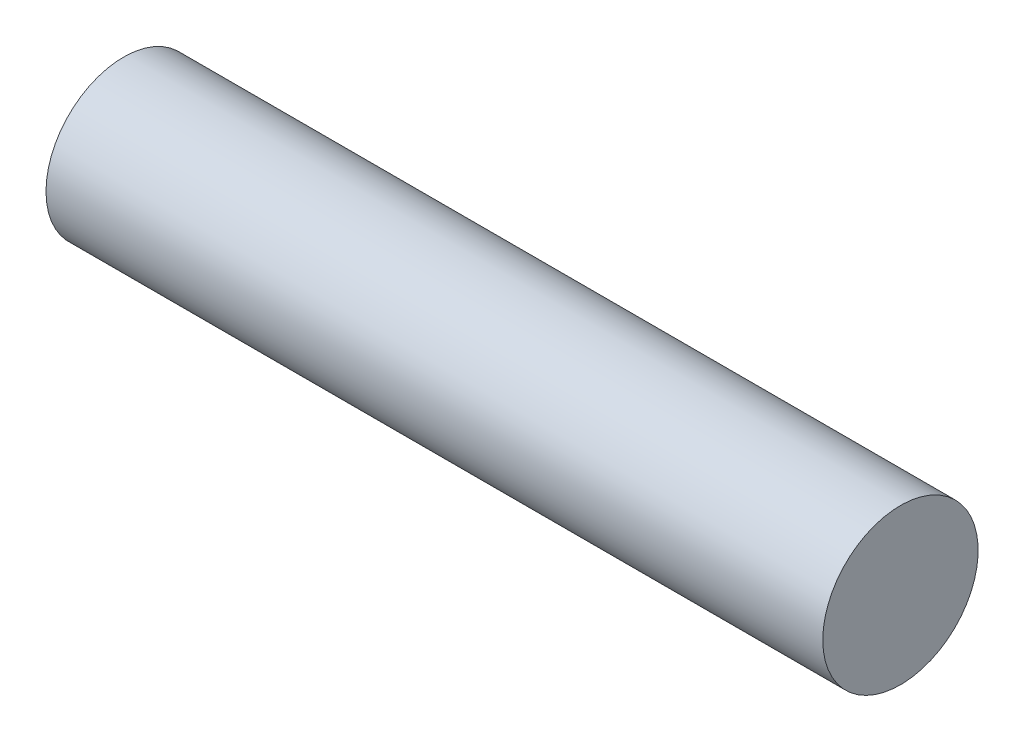
ISO-10303-21;
HEADER;
FILE_DESCRIPTION(('STEP AP214'),'2;1');
FILE_NAME('part.step','',(''),(''),'','','');
FILE_SCHEMA(('AUTOMOTIVE_DESIGN { 1 0 10303 214 1 1 1 1 }'));
ENDSEC;
DATA;
#1=APPLICATION_CONTEXT('core data for automotive mechanical design processes');
#2=APPLICATION_PROTOCOL_DEFINITION('international standard','automotive_design',2000,#1);
#3=PRODUCT_CONTEXT('',#1,'mechanical');
#4=PRODUCT('Part','Part','',(#3));
#5=PRODUCT_RELATED_PRODUCT_CATEGORY('part','',(#4));
#6=PRODUCT_DEFINITION_FORMATION('','',#4);
#7=PRODUCT_DEFINITION_CONTEXT('part definition',#1,'design');
#8=PRODUCT_DEFINITION('design','',#6,#7);
#9=PRODUCT_DEFINITION_SHAPE('','',#8);
#10=(LENGTH_UNIT() NAMED_UNIT(*) SI_UNIT(.MILLI.,.METRE.));
#11=(NAMED_UNIT(*) PLANE_ANGLE_UNIT() SI_UNIT($,.RADIAN.));
#12=(NAMED_UNIT(*) SI_UNIT($,.STERADIAN.) SOLID_ANGLE_UNIT());
#13=UNCERTAINTY_MEASURE_WITH_UNIT(LENGTH_MEASURE(1.E-05),#10,'distance_accuracy_value','');
#14=(GEOMETRIC_REPRESENTATION_CONTEXT(3) GLOBAL_UNCERTAINTY_ASSIGNED_CONTEXT((#13)) GLOBAL_UNIT_ASSIGNED_CONTEXT((#10,
#11,#12)) REPRESENTATION_CONTEXT('',''));
#15=CARTESIAN_POINT('',(0.,0.,0.));
#16=DIRECTION('',(0.,0.,1.));
#17=DIRECTION('',(1.,0.,0.));
#18=AXIS2_PLACEMENT_3D('',#15,#16,#17);
#19=CARTESIAN_POINT('',(-100.,0.,0.410813604982917));
#20=DIRECTION('',(1.,0.,0.));
#21=DIRECTION('',(0.,0.,-1.));
#22=AXIS2_PLACEMENT_3D('',#19,#20,#21);
#23=PLANE('',#22);
#24=CARTESIAN_POINT('',(-100.,0.,0.410813604982917));
#25=DIRECTION('',(-1.,0.,0.));
#26=DIRECTION('',(0.,0.,1.));
#27=AXIS2_PLACEMENT_3D('',#24,#25,#26);
#28=CIRCLE('',#27,20.);
#29=CARTESIAN_POINT('',(-100.,0.,20.4108136049829));
#30=VERTEX_POINT('',#29);
#31=EDGE_CURVE('E10',#30,#30,#28,.T.);
#32=ORIENTED_EDGE('',*,*,#31,.T.);
#33=EDGE_LOOP('',(#32));
#34=FACE_BOUND('',#33,.T.);
#35=ADVANCED_FACE('F37',(#34),#23,.F.);
#36=CARTESIAN_POINT('',(-100.,0.,0.410813604982917));
#37=DIRECTION('',(-1.,0.,0.));
#38=DIRECTION('',(0.,0.,1.));
#39=AXIS2_PLACEMENT_3D('',#36,#37,#38);
#40=CYLINDRICAL_SURFACE('',#39,20.);
#41=ORIENTED_EDGE('',*,*,#31,.F.);
#42=EDGE_LOOP('',(#41));
#43=FACE_BOUND('',#42,.T.);
#44=CARTESIAN_POINT('',(100.,0.,0.410813604982917));
#45=DIRECTION('',(-1.,0.,0.));
#46=DIRECTION('',(0.,0.,1.));
#47=AXIS2_PLACEMENT_3D('',#44,#45,#46);
#48=CIRCLE('',#47,20.);
#49=CARTESIAN_POINT('',(100.,0.,20.4108136049829));
#50=VERTEX_POINT('',#49);
#51=EDGE_CURVE('E44',#50,#50,#48,.T.);
#52=ORIENTED_EDGE('',*,*,#51,.T.);
#53=EDGE_LOOP('',(#52));
#54=FACE_BOUND('',#53,.T.);
#55=ADVANCED_FACE('F51',(#43,#54),#40,.T.);
#56=CARTESIAN_POINT('',(100.,0.,0.410813604982917));
#57=DIRECTION('',(-1.,0.,0.));
#58=DIRECTION('',(0.,0.,1.));
#59=AXIS2_PLACEMENT_3D('',#56,#57,#58);
#60=PLANE('',#59);
#61=ORIENTED_EDGE('',*,*,#51,.F.);
#62=EDGE_LOOP('',(#61));
#63=FACE_BOUND('',#62,.T.);
#64=ADVANCED_FACE('F53',(#63),#60,.F.);
#65=CLOSED_SHELL('',(#35,#55,#64));
#66=MANIFOLD_SOLID_BREP('B2',#65);
#67=ADVANCED_BREP_SHAPE_REPRESENTATION('',(#18,#66),#14);
#68=SHAPE_DEFINITION_REPRESENTATION(#9,#67);
ENDSEC;
END-ISO-10303-21;
